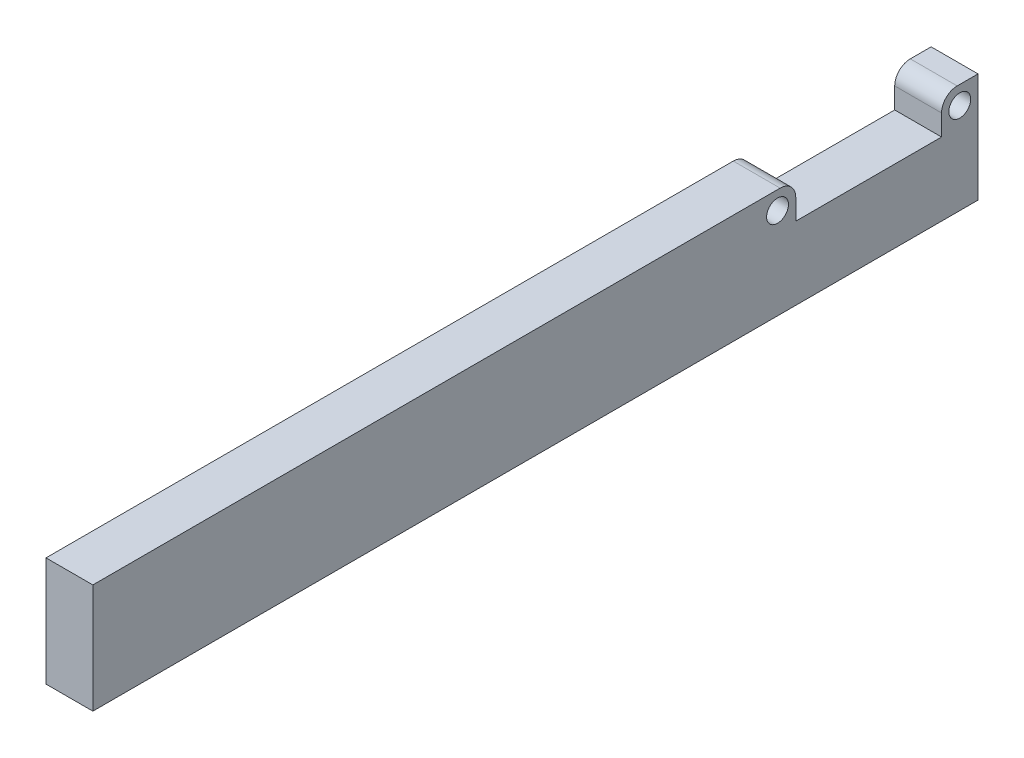
ISO-10303-21;
HEADER;
FILE_DESCRIPTION(('STEP AP214'),'2;1');
FILE_NAME('part.step','',(''),(''),'','','');
FILE_SCHEMA(('AUTOMOTIVE_DESIGN { 1 0 10303 214 1 1 1 1 }'));
ENDSEC;
DATA;
#1=APPLICATION_CONTEXT('core data for automotive mechanical design processes');
#2=APPLICATION_PROTOCOL_DEFINITION('international standard','automotive_design',2000,#1);
#3=PRODUCT_CONTEXT('',#1,'mechanical');
#4=PRODUCT('Part','Part','',(#3));
#5=PRODUCT_RELATED_PRODUCT_CATEGORY('part','',(#4));
#6=PRODUCT_DEFINITION_FORMATION('','',#4);
#7=PRODUCT_DEFINITION_CONTEXT('part definition',#1,'design');
#8=PRODUCT_DEFINITION('design','',#6,#7);
#9=PRODUCT_DEFINITION_SHAPE('','',#8);
#10=(LENGTH_UNIT() NAMED_UNIT(*) SI_UNIT(.MILLI.,.METRE.));
#11=(NAMED_UNIT(*) PLANE_ANGLE_UNIT() SI_UNIT($,.RADIAN.));
#12=(NAMED_UNIT(*) SI_UNIT($,.STERADIAN.) SOLID_ANGLE_UNIT());
#13=UNCERTAINTY_MEASURE_WITH_UNIT(LENGTH_MEASURE(1.E-05),#10,'distance_accuracy_value','');
#14=(GEOMETRIC_REPRESENTATION_CONTEXT(3) GLOBAL_UNCERTAINTY_ASSIGNED_CONTEXT((#13)) GLOBAL_UNIT_ASSIGNED_CONTEXT((#10,
#11,#12)) REPRESENTATION_CONTEXT('',''));
#15=CARTESIAN_POINT('',(0.,0.,0.));
#16=DIRECTION('',(0.,0.,1.));
#17=DIRECTION('',(1.,0.,0.));
#18=AXIS2_PLACEMENT_3D('',#15,#16,#17);
#19=CARTESIAN_POINT('',(4.5,21.,0.));
#20=DIRECTION('',(0.,1.,0.));
#21=DIRECTION('',(0.,0.,-1.));
#22=AXIS2_PLACEMENT_3D('',#19,#20,#21);
#23=PLANE('',#22);
#24=DIRECTION('',(0.,0.,1.));
#25=VECTOR('',#24,1.);
#26=CARTESIAN_POINT('',(-4.5,21.,0.));
#27=LINE('',#26,#25);
#28=CARTESIAN_POINT('',(-4.5,21.,38.));
#29=VERTEX_POINT('',#28);
#30=CARTESIAN_POINT('',(-4.5,21.,170.));
#31=VERTEX_POINT('',#30);
#32=EDGE_CURVE('E163',#29,#31,#27,.T.);
#33=ORIENTED_EDGE('',*,*,#32,.T.);
#34=DIRECTION('',(-1.,0.,0.));
#35=VECTOR('',#34,1.);
#36=CARTESIAN_POINT('',(4.5,21.,170.));
#37=LINE('',#36,#35);
#38=CARTESIAN_POINT('',(4.5,21.,170.));
#39=VERTEX_POINT('',#38);
#40=EDGE_CURVE('E178',#39,#31,#37,.T.);
#41=ORIENTED_EDGE('',*,*,#40,.F.);
#42=DIRECTION('',(0.,0.,1.));
#43=VECTOR('',#42,1.);
#44=CARTESIAN_POINT('',(4.5,21.,0.));
#45=LINE('',#44,#43);
#46=CARTESIAN_POINT('',(4.5,21.,38.));
#47=VERTEX_POINT('',#46);
#48=EDGE_CURVE('E151',#47,#39,#45,.T.);
#49=ORIENTED_EDGE('',*,*,#48,.F.);
#50=DIRECTION('',(1.,0.,0.));
#51=VECTOR('',#50,1.);
#52=CARTESIAN_POINT('',(4.5,21.,38.));
#53=LINE('',#52,#51);
#54=EDGE_CURVE('E174',#29,#47,#53,.T.);
#55=ORIENTED_EDGE('',*,*,#54,.F.);
#56=EDGE_LOOP('',(#33,#41,#49,#55));
#57=FACE_BOUND('',#56,.T.);
#58=ADVANCED_FACE('F35',(#57),#23,.T.);
#59=CARTESIAN_POINT('',(4.5,0.,0.));
#60=DIRECTION('',(0.,0.,-1.));
#61=DIRECTION('',(1.,0.,0.));
#62=AXIS2_PLACEMENT_3D('',#59,#60,#61);
#63=PLANE('',#62);
#64=DIRECTION('',(0.,1.,0.));
#65=VECTOR('',#64,1.);
#66=CARTESIAN_POINT('',(-4.5,0.,0.));
#67=LINE('',#66,#65);
#68=CARTESIAN_POINT('',(-4.5,0.,0.));
#69=VERTEX_POINT('',#68);
#70=CARTESIAN_POINT('',(-4.5,21.,0.));
#71=VERTEX_POINT('',#70);
#72=EDGE_CURVE('E146',#69,#71,#67,.T.);
#73=ORIENTED_EDGE('',*,*,#72,.T.);
#74=DIRECTION('',(-1.,0.,0.));
#75=VECTOR('',#74,1.);
#76=CARTESIAN_POINT('',(4.5,21.,0.));
#77=LINE('',#76,#75);
#78=CARTESIAN_POINT('',(4.5,21.,0.));
#79=VERTEX_POINT('',#78);
#80=EDGE_CURVE('E160',#79,#71,#77,.T.);
#81=ORIENTED_EDGE('',*,*,#80,.F.);
#82=DIRECTION('',(0.,1.,0.));
#83=VECTOR('',#82,1.);
#84=CARTESIAN_POINT('',(4.5,0.,0.));
#85=LINE('',#84,#83);
#86=CARTESIAN_POINT('',(4.5,0.,0.));
#87=VERTEX_POINT('',#86);
#88=EDGE_CURVE('E148',#87,#79,#85,.T.);
#89=ORIENTED_EDGE('',*,*,#88,.F.);
#90=DIRECTION('',(-1.,0.,0.));
#91=VECTOR('',#90,1.);
#92=CARTESIAN_POINT('',(4.5,0.,0.));
#93=LINE('',#92,#91);
#94=EDGE_CURVE('E171',#87,#69,#93,.T.);
#95=ORIENTED_EDGE('',*,*,#94,.T.);
#96=EDGE_LOOP('',(#73,#81,#89,#95));
#97=FACE_BOUND('',#96,.T.);
#98=ADVANCED_FACE('F218',(#97),#63,.T.);
#99=CARTESIAN_POINT('',(4.5,0.,0.));
#100=DIRECTION('',(0.,1.,0.));
#101=DIRECTION('',(0.,0.,-1.));
#102=AXIS2_PLACEMENT_3D('',#99,#100,#101);
#103=PLANE('',#102);
#104=DIRECTION('',(0.,0.,1.));
#105=VECTOR('',#104,1.);
#106=CARTESIAN_POINT('',(-4.5,0.,0.));
#107=LINE('',#106,#105);
#108=CARTESIAN_POINT('',(-4.5,0.,170.));
#109=VERTEX_POINT('',#108);
#110=EDGE_CURVE('E152',#69,#109,#107,.T.);
#111=ORIENTED_EDGE('',*,*,#110,.F.);
#112=ORIENTED_EDGE('',*,*,#94,.F.);
#113=DIRECTION('',(0.,0.,1.));
#114=VECTOR('',#113,1.);
#115=CARTESIAN_POINT('',(4.5,0.,0.));
#116=LINE('',#115,#114);
#117=CARTESIAN_POINT('',(4.5,0.,170.));
#118=VERTEX_POINT('',#117);
#119=EDGE_CURVE('E157',#87,#118,#116,.T.);
#120=ORIENTED_EDGE('',*,*,#119,.T.);
#121=DIRECTION('',(-1.,0.,0.));
#122=VECTOR('',#121,1.);
#123=CARTESIAN_POINT('',(4.5,0.,170.));
#124=LINE('',#123,#122);
#125=EDGE_CURVE('E175',#118,#109,#124,.T.);
#126=ORIENTED_EDGE('',*,*,#125,.T.);
#127=EDGE_LOOP('',(#111,#112,#120,#126));
#128=FACE_BOUND('',#127,.T.);
#129=ADVANCED_FACE('F215',(#128),#103,.F.);
#130=CARTESIAN_POINT('',(4.5,0.,170.));
#131=DIRECTION('',(0.,0.,-1.));
#132=DIRECTION('',(1.,0.,0.));
#133=AXIS2_PLACEMENT_3D('',#130,#131,#132);
#134=PLANE('',#133);
#135=DIRECTION('',(0.,1.,0.));
#136=VECTOR('',#135,1.);
#137=CARTESIAN_POINT('',(-4.5,0.,170.));
#138=LINE('',#137,#136);
#139=EDGE_CURVE('E167',#109,#31,#138,.T.);
#140=ORIENTED_EDGE('',*,*,#139,.F.);
#141=ORIENTED_EDGE('',*,*,#125,.F.);
#142=DIRECTION('',(0.,1.,0.));
#143=VECTOR('',#142,1.);
#144=CARTESIAN_POINT('',(4.5,0.,170.));
#145=LINE('',#144,#143);
#146=EDGE_CURVE('E155',#118,#39,#145,.T.);
#147=ORIENTED_EDGE('',*,*,#146,.T.);
#148=ORIENTED_EDGE('',*,*,#40,.T.);
#149=EDGE_LOOP('',(#140,#141,#147,#148));
#150=FACE_BOUND('',#149,.T.);
#151=ADVANCED_FACE('F209',(#150),#134,.F.);
#152=CARTESIAN_POINT('',(4.5,21.,4.));
#153=VERTEX_POINT('',#152);
#154=EDGE_CURVE('E153',#79,#153,#45,.T.);
#155=ORIENTED_EDGE('',*,*,#154,.F.);
#156=ORIENTED_EDGE('',*,*,#80,.T.);
#157=CARTESIAN_POINT('',(-4.5,21.,4.));
#158=VERTEX_POINT('',#157);
#159=EDGE_CURVE('E164',#71,#158,#27,.T.);
#160=ORIENTED_EDGE('',*,*,#159,.T.);
#161=DIRECTION('',(1.,0.,0.));
#162=VECTOR('',#161,1.);
#163=CARTESIAN_POINT('',(-4.5,21.,4.));
#164=LINE('',#163,#162);
#165=EDGE_CURVE('E11',#153,#158,#164,.F.);
#166=ORIENTED_EDGE('',*,*,#165,.F.);
#167=EDGE_LOOP('',(#155,#156,#160,#166));
#168=FACE_BOUND('',#167,.T.);
#169=ADVANCED_FACE('F220',(#168),#23,.T.);
#170=CARTESIAN_POINT('',(4.5,0.,0.));
#171=DIRECTION('',(-1.,0.,0.));
#172=DIRECTION('',(0.,0.,-1.));
#173=AXIS2_PLACEMENT_3D('',#170,#171,#172);
#174=PLANE('',#173);
#175=CARTESIAN_POINT('',(4.5,17.5,3.49999999999999));
#176=DIRECTION('',(-1.,0.,0.));
#177=DIRECTION('',(0.,0.,1.));
#178=AXIS2_PLACEMENT_3D('',#175,#176,#177);
#179=CIRCLE('',#178,2.1);
#180=CARTESIAN_POINT('',(4.5,17.5,5.59999999999999));
#181=VERTEX_POINT('',#180);
#182=EDGE_CURVE('E274',#181,#181,#179,.T.);
#183=ORIENTED_EDGE('',*,*,#182,.T.);
#184=EDGE_LOOP('',(#183));
#185=FACE_BOUND('',#184,.T.);
#186=CARTESIAN_POINT('',(4.5,17.5,38.5));
#187=DIRECTION('',(-1.,0.,0.));
#188=DIRECTION('',(0.,0.,1.));
#189=AXIS2_PLACEMENT_3D('',#186,#187,#188);
#190=CIRCLE('',#189,2.1);
#191=CARTESIAN_POINT('',(4.5,17.5,40.6));
#192=VERTEX_POINT('',#191);
#193=EDGE_CURVE('E136',#192,#192,#190,.T.);
#194=ORIENTED_EDGE('',*,*,#193,.T.);
#195=EDGE_LOOP('',(#194));
#196=FACE_BOUND('',#195,.T.);
#197=ORIENTED_EDGE('',*,*,#48,.T.);
#198=ORIENTED_EDGE('',*,*,#146,.F.);
#199=ORIENTED_EDGE('',*,*,#119,.F.);
#200=ORIENTED_EDGE('',*,*,#88,.T.);
#201=ORIENTED_EDGE('',*,*,#154,.T.);
#202=CARTESIAN_POINT('',(4.5,18.,4.));
#203=DIRECTION('',(1.,0.,0.));
#204=DIRECTION('',(0.,0.,-1.));
#205=AXIS2_PLACEMENT_3D('',#202,#203,#204);
#206=CIRCLE('',#205,3.);
#207=CARTESIAN_POINT('',(4.5,18.,7.));
#208=VERTEX_POINT('',#207);
#209=EDGE_CURVE('E132',#208,#153,#206,.F.);
#210=ORIENTED_EDGE('',*,*,#209,.F.);
#211=DIRECTION('',(0.,-1.,0.));
#212=VECTOR('',#211,1.);
#213=CARTESIAN_POINT('',(4.5,21.,7.));
#214=LINE('',#213,#212);
#215=CARTESIAN_POINT('',(4.5,14.,7.));
#216=VERTEX_POINT('',#215);
#217=EDGE_CURVE('E112',#208,#216,#214,.T.);
#218=ORIENTED_EDGE('',*,*,#217,.T.);
#219=DIRECTION('',(0.,0.,1.));
#220=VECTOR('',#219,1.);
#221=CARTESIAN_POINT('',(4.5,14.,7.));
#222=LINE('',#221,#220);
#223=CARTESIAN_POINT('',(4.5,14.,35.));
#224=VERTEX_POINT('',#223);
#225=EDGE_CURVE('E122',#216,#224,#222,.T.);
#226=ORIENTED_EDGE('',*,*,#225,.T.);
#227=DIRECTION('',(0.,1.,0.));
#228=VECTOR('',#227,1.);
#229=CARTESIAN_POINT('',(4.5,14.,35.));
#230=LINE('',#229,#228);
#231=CARTESIAN_POINT('',(4.5,18.,35.));
#232=VERTEX_POINT('',#231);
#233=EDGE_CURVE('E127',#224,#232,#230,.T.);
#234=ORIENTED_EDGE('',*,*,#233,.T.);
#235=CARTESIAN_POINT('',(4.5,18.,38.));
#236=DIRECTION('',(1.,0.,0.));
#237=DIRECTION('',(0.,0.,-1.));
#238=AXIS2_PLACEMENT_3D('',#235,#236,#237);
#239=CIRCLE('',#238,3.);
#240=EDGE_CURVE('E186',#47,#232,#239,.F.);
#241=ORIENTED_EDGE('',*,*,#240,.F.);
#242=EDGE_LOOP('',(#197,#198,#199,#200,#201,#210,#218,#226,#234,#241));
#243=FACE_BOUND('',#242,.T.);
#244=ADVANCED_FACE('F130',(#185,#196,#243),#174,.F.);
#245=CARTESIAN_POINT('',(-4.5,0.,0.));
#246=DIRECTION('',(-1.,0.,0.));
#247=DIRECTION('',(0.,0.,-1.));
#248=AXIS2_PLACEMENT_3D('',#245,#246,#247);
#249=PLANE('',#248);
#250=CARTESIAN_POINT('',(-4.5,17.5,3.49999999999999));
#251=DIRECTION('',(-1.,0.,0.));
#252=DIRECTION('',(0.,0.,1.));
#253=AXIS2_PLACEMENT_3D('',#250,#251,#252);
#254=CIRCLE('',#253,2.1);
#255=CARTESIAN_POINT('',(-4.5,17.5,5.59999999999999));
#256=VERTEX_POINT('',#255);
#257=EDGE_CURVE('E268',#256,#256,#254,.T.);
#258=ORIENTED_EDGE('',*,*,#257,.F.);
#259=EDGE_LOOP('',(#258));
#260=FACE_BOUND('',#259,.T.);
#261=CARTESIAN_POINT('',(-4.5,17.5,38.5));
#262=DIRECTION('',(-1.,0.,0.));
#263=DIRECTION('',(0.,0.,1.));
#264=AXIS2_PLACEMENT_3D('',#261,#262,#263);
#265=CIRCLE('',#264,2.1);
#266=CARTESIAN_POINT('',(-4.5,17.5,40.6));
#267=VERTEX_POINT('',#266);
#268=EDGE_CURVE('E133',#267,#267,#265,.T.);
#269=ORIENTED_EDGE('',*,*,#268,.F.);
#270=EDGE_LOOP('',(#269));
#271=FACE_BOUND('',#270,.T.);
#272=DIRECTION('',(0.,1.,0.));
#273=VECTOR('',#272,1.);
#274=CARTESIAN_POINT('',(-4.5,14.,35.));
#275=LINE('',#274,#273);
#276=CARTESIAN_POINT('',(-4.5,14.,35.));
#277=VERTEX_POINT('',#276);
#278=CARTESIAN_POINT('',(-4.5,18.,35.));
#279=VERTEX_POINT('',#278);
#280=EDGE_CURVE('E119',#277,#279,#275,.T.);
#281=ORIENTED_EDGE('',*,*,#280,.F.);
#282=DIRECTION('',(0.,0.,1.));
#283=VECTOR('',#282,1.);
#284=CARTESIAN_POINT('',(-4.5,14.,7.));
#285=LINE('',#284,#283);
#286=CARTESIAN_POINT('',(-4.5,14.,7.));
#287=VERTEX_POINT('',#286);
#288=EDGE_CURVE('E142',#287,#277,#285,.T.);
#289=ORIENTED_EDGE('',*,*,#288,.F.);
#290=DIRECTION('',(0.,-1.,0.));
#291=VECTOR('',#290,1.);
#292=CARTESIAN_POINT('',(-4.5,21.,7.));
#293=LINE('',#292,#291);
#294=CARTESIAN_POINT('',(-4.5,18.,7.));
#295=VERTEX_POINT('',#294);
#296=EDGE_CURVE('E114',#295,#287,#293,.T.);
#297=ORIENTED_EDGE('',*,*,#296,.F.);
#298=CARTESIAN_POINT('',(-4.5,18.,4.));
#299=DIRECTION('',(1.,0.,0.));
#300=DIRECTION('',(0.,0.,-1.));
#301=AXIS2_PLACEMENT_3D('',#298,#299,#300);
#302=CIRCLE('',#301,3.);
#303=EDGE_CURVE('E56',#158,#295,#302,.T.);
#304=ORIENTED_EDGE('',*,*,#303,.F.);
#305=ORIENTED_EDGE('',*,*,#159,.F.);
#306=ORIENTED_EDGE('',*,*,#72,.F.);
#307=ORIENTED_EDGE('',*,*,#110,.T.);
#308=ORIENTED_EDGE('',*,*,#139,.T.);
#309=ORIENTED_EDGE('',*,*,#32,.F.);
#310=CARTESIAN_POINT('',(-4.5,18.,38.));
#311=DIRECTION('',(1.,0.,0.));
#312=DIRECTION('',(0.,0.,-1.));
#313=AXIS2_PLACEMENT_3D('',#310,#311,#312);
#314=CIRCLE('',#313,3.);
#315=EDGE_CURVE('E192',#279,#29,#314,.T.);
#316=ORIENTED_EDGE('',*,*,#315,.F.);
#317=EDGE_LOOP('',(#281,#289,#297,#304,#305,#306,#307,#308,#309,#316));
#318=FACE_BOUND('',#317,.T.);
#319=ADVANCED_FACE('F196',(#260,#271,#318),#249,.T.);
#320=CARTESIAN_POINT('',(-4.5,14.,35.));
#321=DIRECTION('',(0.,0.,1.));
#322=DIRECTION('',(-1.,0.,0.));
#323=AXIS2_PLACEMENT_3D('',#320,#321,#322);
#324=PLANE('',#323);
#325=ORIENTED_EDGE('',*,*,#233,.F.);
#326=DIRECTION('',(1.,0.,0.));
#327=VECTOR('',#326,1.);
#328=CARTESIAN_POINT('',(-4.5,14.,35.));
#329=LINE('',#328,#327);
#330=EDGE_CURVE('E118',#277,#224,#329,.T.);
#331=ORIENTED_EDGE('',*,*,#330,.F.);
#332=ORIENTED_EDGE('',*,*,#280,.T.);
#333=DIRECTION('',(1.,0.,0.));
#334=VECTOR('',#333,1.);
#335=CARTESIAN_POINT('',(-4.5,18.,35.));
#336=LINE('',#335,#334);
#337=EDGE_CURVE('E189',#232,#279,#336,.F.);
#338=ORIENTED_EDGE('',*,*,#337,.F.);
#339=EDGE_LOOP('',(#325,#331,#332,#338));
#340=FACE_BOUND('',#339,.T.);
#341=ADVANCED_FACE('F200',(#340),#324,.F.);
#342=CARTESIAN_POINT('',(-4.5,14.,7.));
#343=DIRECTION('',(0.,-1.,0.));
#344=DIRECTION('',(0.,0.,1.));
#345=AXIS2_PLACEMENT_3D('',#342,#343,#344);
#346=PLANE('',#345);
#347=ORIENTED_EDGE('',*,*,#330,.T.);
#348=ORIENTED_EDGE('',*,*,#225,.F.);
#349=DIRECTION('',(1.,0.,0.));
#350=VECTOR('',#349,1.);
#351=CARTESIAN_POINT('',(-4.5,14.,7.));
#352=LINE('',#351,#350);
#353=EDGE_CURVE('E108',#287,#216,#352,.T.);
#354=ORIENTED_EDGE('',*,*,#353,.F.);
#355=ORIENTED_EDGE('',*,*,#288,.T.);
#356=EDGE_LOOP('',(#347,#348,#354,#355));
#357=FACE_BOUND('',#356,.T.);
#358=ADVANCED_FACE('F123',(#357),#346,.F.);
#359=CARTESIAN_POINT('',(-4.5,21.,7.));
#360=DIRECTION('',(0.,0.,-1.));
#361=DIRECTION('',(1.,0.,0.));
#362=AXIS2_PLACEMENT_3D('',#359,#360,#361);
#363=PLANE('',#362);
#364=ORIENTED_EDGE('',*,*,#296,.T.);
#365=ORIENTED_EDGE('',*,*,#353,.T.);
#366=ORIENTED_EDGE('',*,*,#217,.F.);
#367=DIRECTION('',(1.,0.,0.));
#368=VECTOR('',#367,1.);
#369=CARTESIAN_POINT('',(4.5,18.,7.));
#370=LINE('',#369,#368);
#371=EDGE_CURVE('E43',#295,#208,#370,.T.);
#372=ORIENTED_EDGE('',*,*,#371,.F.);
#373=EDGE_LOOP('',(#364,#365,#366,#372));
#374=FACE_BOUND('',#373,.T.);
#375=ADVANCED_FACE('F110',(#374),#363,.F.);
#376=CARTESIAN_POINT('',(4.5,17.5,38.5));
#377=DIRECTION('',(1.,0.,0.));
#378=DIRECTION('',(0.,0.,1.));
#379=AXIS2_PLACEMENT_3D('',#376,#377,#378);
#380=CYLINDRICAL_SURFACE('',#379,2.1);
#381=ORIENTED_EDGE('',*,*,#268,.T.);
#382=EDGE_LOOP('',(#381));
#383=FACE_BOUND('',#382,.T.);
#384=ORIENTED_EDGE('',*,*,#193,.F.);
#385=EDGE_LOOP('',(#384));
#386=FACE_BOUND('',#385,.T.);
#387=ADVANCED_FACE('F245',(#383,#386),#380,.F.);
#388=CARTESIAN_POINT('',(4.5,17.5,3.49999999999999));
#389=DIRECTION('',(1.,0.,0.));
#390=DIRECTION('',(0.,0.,1.));
#391=AXIS2_PLACEMENT_3D('',#388,#389,#390);
#392=CYLINDRICAL_SURFACE('',#391,2.1);
#393=ORIENTED_EDGE('',*,*,#257,.T.);
#394=EDGE_LOOP('',(#393));
#395=FACE_BOUND('',#394,.T.);
#396=ORIENTED_EDGE('',*,*,#182,.F.);
#397=EDGE_LOOP('',(#396));
#398=FACE_BOUND('',#397,.T.);
#399=ADVANCED_FACE('F240',(#395,#398),#392,.F.);
#400=CARTESIAN_POINT('',(4.5,18.,38.));
#401=DIRECTION('',(-1.,0.,0.));
#402=DIRECTION('',(0.,0.,-1.));
#403=AXIS2_PLACEMENT_3D('',#400,#401,#402);
#404=CYLINDRICAL_SURFACE('',#403,3.);
#405=ORIENTED_EDGE('',*,*,#315,.T.);
#406=ORIENTED_EDGE('',*,*,#54,.T.);
#407=ORIENTED_EDGE('',*,*,#240,.T.);
#408=ORIENTED_EDGE('',*,*,#337,.T.);
#409=EDGE_LOOP('',(#405,#406,#407,#408));
#410=FACE_BOUND('',#409,.T.);
#411=ADVANCED_FACE('F205',(#410),#404,.T.);
#412=CARTESIAN_POINT('',(-4.5,18.,4.));
#413=DIRECTION('',(-1.,0.,0.));
#414=DIRECTION('',(0.,0.,-1.));
#415=AXIS2_PLACEMENT_3D('',#412,#413,#414);
#416=CYLINDRICAL_SURFACE('',#415,3.);
#417=ORIENTED_EDGE('',*,*,#303,.T.);
#418=ORIENTED_EDGE('',*,*,#371,.T.);
#419=ORIENTED_EDGE('',*,*,#209,.T.);
#420=ORIENTED_EDGE('',*,*,#165,.T.);
#421=EDGE_LOOP('',(#417,#418,#419,#420));
#422=FACE_BOUND('',#421,.T.);
#423=ADVANCED_FACE('F37',(#422),#416,.T.);
#424=CLOSED_SHELL('',(#58,#98,#129,#151,#169,#244,#319,#341,#358,#375,#387,#399,#411,#423));
#425=MANIFOLD_SOLID_BREP('B2',#424);
#426=ADVANCED_BREP_SHAPE_REPRESENTATION('',(#18,#425),#14);
#427=SHAPE_DEFINITION_REPRESENTATION(#9,#426);
ENDSEC;
END-ISO-10303-21;
